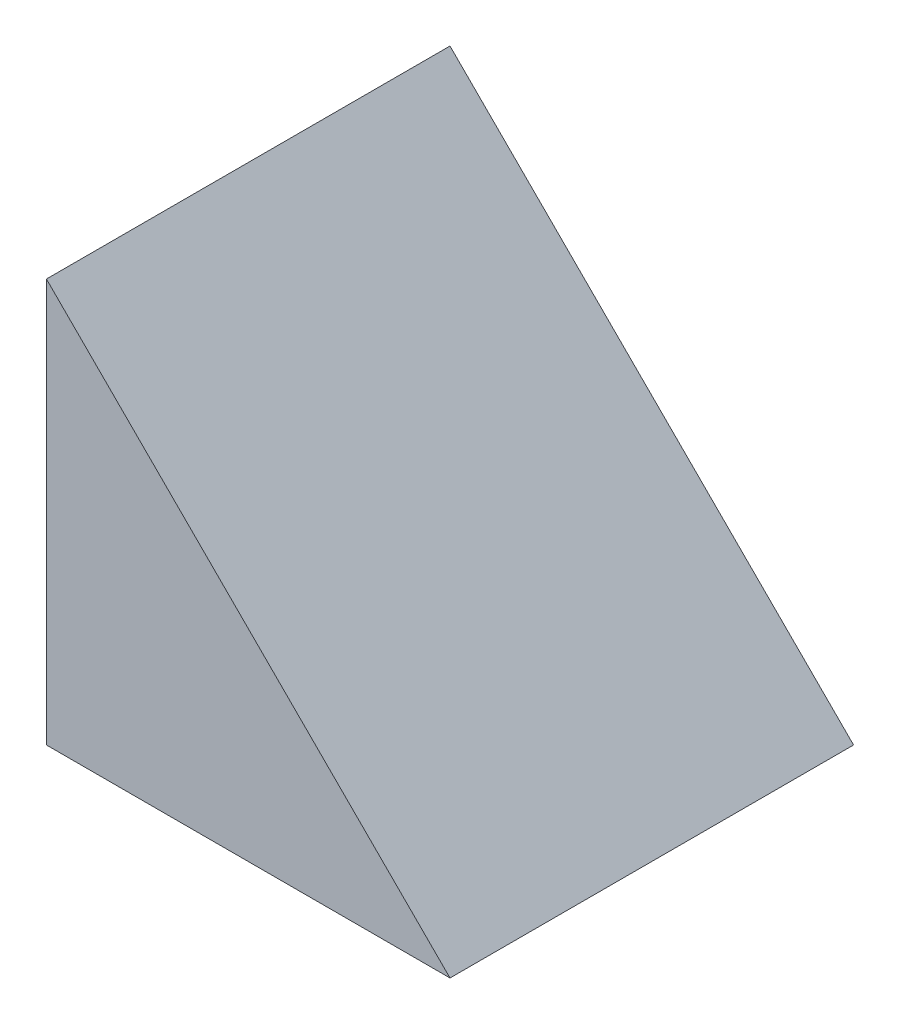
ISO-10303-21;
HEADER;
FILE_DESCRIPTION(('STEP AP214'),'2;1');
FILE_NAME('part.step','',(''),(''),'','','');
FILE_SCHEMA(('AUTOMOTIVE_DESIGN { 1 0 10303 214 1 1 1 1 }'));
ENDSEC;
DATA;
#1=APPLICATION_CONTEXT('core data for automotive mechanical design processes');
#2=APPLICATION_PROTOCOL_DEFINITION('international standard','automotive_design',2000,#1);
#3=PRODUCT_CONTEXT('',#1,'mechanical');
#4=PRODUCT('Part','Part','',(#3));
#5=PRODUCT_RELATED_PRODUCT_CATEGORY('part','',(#4));
#6=PRODUCT_DEFINITION_FORMATION('','',#4);
#7=PRODUCT_DEFINITION_CONTEXT('part definition',#1,'design');
#8=PRODUCT_DEFINITION('design','',#6,#7);
#9=PRODUCT_DEFINITION_SHAPE('','',#8);
#10=(LENGTH_UNIT() NAMED_UNIT(*) SI_UNIT(.MILLI.,.METRE.));
#11=(NAMED_UNIT(*) PLANE_ANGLE_UNIT() SI_UNIT($,.RADIAN.));
#12=(NAMED_UNIT(*) SI_UNIT($,.STERADIAN.) SOLID_ANGLE_UNIT());
#13=UNCERTAINTY_MEASURE_WITH_UNIT(LENGTH_MEASURE(1.E-05),#10,'distance_accuracy_value','');
#14=(GEOMETRIC_REPRESENTATION_CONTEXT(3) GLOBAL_UNCERTAINTY_ASSIGNED_CONTEXT((#13)) GLOBAL_UNIT_ASSIGNED_CONTEXT((#10,
#11,#12)) REPRESENTATION_CONTEXT('',''));
#15=CARTESIAN_POINT('',(0.,0.,0.));
#16=DIRECTION('',(0.,0.,1.));
#17=DIRECTION('',(1.,0.,0.));
#18=AXIS2_PLACEMENT_3D('',#15,#16,#17);
#19=CARTESIAN_POINT('',(0.,0.,114.3));
#20=DIRECTION('',(1.,0.,0.));
#21=DIRECTION('',(0.,0.,-1.));
#22=AXIS2_PLACEMENT_3D('',#19,#20,#21);
#23=PLANE('',#22);
#24=DIRECTION('',(0.,-1.,0.));
#25=VECTOR('',#24,1.);
#26=CARTESIAN_POINT('',(0.,0.,0.));
#27=LINE('',#26,#25);
#28=CARTESIAN_POINT('',(0.,114.3,0.));
#29=VERTEX_POINT('',#28);
#30=CARTESIAN_POINT('',(0.,0.,0.));
#31=VERTEX_POINT('',#30);
#32=EDGE_CURVE('E80',#29,#31,#27,.T.);
#33=ORIENTED_EDGE('',*,*,#32,.T.);
#34=DIRECTION('',(0.,0.,-1.));
#35=VECTOR('',#34,1.);
#36=CARTESIAN_POINT('',(0.,0.,114.3));
#37=LINE('',#36,#35);
#38=CARTESIAN_POINT('',(0.,0.,114.3));
#39=VERTEX_POINT('',#38);
#40=EDGE_CURVE('E11',#39,#31,#37,.T.);
#41=ORIENTED_EDGE('',*,*,#40,.F.);
#42=DIRECTION('',(0.,-1.,0.));
#43=VECTOR('',#42,1.);
#44=CARTESIAN_POINT('',(0.,0.,114.3));
#45=LINE('',#44,#43);
#46=CARTESIAN_POINT('',(0.,114.3,114.3));
#47=VERTEX_POINT('',#46);
#48=EDGE_CURVE('E73',#47,#39,#45,.T.);
#49=ORIENTED_EDGE('',*,*,#48,.F.);
#50=DIRECTION('',(0.,0.,-1.));
#51=VECTOR('',#50,1.);
#52=CARTESIAN_POINT('',(0.,114.3,114.3));
#53=LINE('',#52,#51);
#54=EDGE_CURVE('E81',#47,#29,#53,.T.);
#55=ORIENTED_EDGE('',*,*,#54,.T.);
#56=EDGE_LOOP('',(#33,#41,#49,#55));
#57=FACE_BOUND('',#56,.T.);
#58=ADVANCED_FACE('F33',(#57),#23,.F.);
#59=CARTESIAN_POINT('',(0.,0.,114.3));
#60=DIRECTION('',(0.,1.,0.));
#61=DIRECTION('',(0.,0.,1.));
#62=AXIS2_PLACEMENT_3D('',#59,#60,#61);
#63=PLANE('',#62);
#64=DIRECTION('',(1.,0.,0.));
#65=VECTOR('',#64,1.);
#66=CARTESIAN_POINT('',(0.,0.,0.));
#67=LINE('',#66,#65);
#68=CARTESIAN_POINT('',(114.3,0.,0.));
#69=VERTEX_POINT('',#68);
#70=EDGE_CURVE('E61',#31,#69,#67,.T.);
#71=ORIENTED_EDGE('',*,*,#70,.T.);
#72=DIRECTION('',(0.,0.,-1.));
#73=VECTOR('',#72,1.);
#74=CARTESIAN_POINT('',(114.3,0.,114.3));
#75=LINE('',#74,#73);
#76=CARTESIAN_POINT('',(114.3,0.,114.3));
#77=VERTEX_POINT('',#76);
#78=EDGE_CURVE('E41',#77,#69,#75,.T.);
#79=ORIENTED_EDGE('',*,*,#78,.F.);
#80=DIRECTION('',(1.,0.,0.));
#81=VECTOR('',#80,1.);
#82=CARTESIAN_POINT('',(0.,0.,114.3));
#83=LINE('',#82,#81);
#84=EDGE_CURVE('E69',#39,#77,#83,.T.);
#85=ORIENTED_EDGE('',*,*,#84,.F.);
#86=ORIENTED_EDGE('',*,*,#40,.T.);
#87=EDGE_LOOP('',(#71,#79,#85,#86));
#88=FACE_BOUND('',#87,.T.);
#89=ADVANCED_FACE('F70',(#88),#63,.F.);
#90=CARTESIAN_POINT('',(0.,114.3,114.3));
#91=DIRECTION('',(-0.707106781186547,-0.707106781186547,0.));
#92=DIRECTION('',(0.707106781186548,-0.707106781186548,0.));
#93=AXIS2_PLACEMENT_3D('',#90,#91,#92);
#94=PLANE('',#93);
#95=DIRECTION('',(-0.707106781186548,0.707106781186548,0.));
#96=VECTOR('',#95,1.);
#97=CARTESIAN_POINT('',(0.,114.3,0.));
#98=LINE('',#97,#96);
#99=EDGE_CURVE('E66',#69,#29,#98,.T.);
#100=ORIENTED_EDGE('',*,*,#99,.T.);
#101=ORIENTED_EDGE('',*,*,#54,.F.);
#102=DIRECTION('',(-0.707106781186548,0.707106781186548,0.));
#103=VECTOR('',#102,1.);
#104=CARTESIAN_POINT('',(0.,114.3,114.3));
#105=LINE('',#104,#103);
#106=EDGE_CURVE('E49',#77,#47,#105,.T.);
#107=ORIENTED_EDGE('',*,*,#106,.F.);
#108=ORIENTED_EDGE('',*,*,#78,.T.);
#109=EDGE_LOOP('',(#100,#101,#107,#108));
#110=FACE_BOUND('',#109,.T.);
#111=ADVANCED_FACE('F88',(#110),#94,.F.);
#112=CARTESIAN_POINT('',(0.,0.,114.3));
#113=DIRECTION('',(0.,0.,-1.));
#114=DIRECTION('',(-1.,0.,0.));
#115=AXIS2_PLACEMENT_3D('',#112,#113,#114);
#116=PLANE('',#115);
#117=ORIENTED_EDGE('',*,*,#48,.T.);
#118=ORIENTED_EDGE('',*,*,#84,.T.);
#119=ORIENTED_EDGE('',*,*,#106,.T.);
#120=EDGE_LOOP('',(#117,#118,#119));
#121=FACE_BOUND('',#120,.T.);
#122=ADVANCED_FACE('F76',(#121),#116,.F.);
#123=CARTESIAN_POINT('',(0.,0.,0.));
#124=DIRECTION('',(0.,0.,-1.));
#125=DIRECTION('',(-1.,0.,0.));
#126=AXIS2_PLACEMENT_3D('',#123,#124,#125);
#127=PLANE('',#126);
#128=ORIENTED_EDGE('',*,*,#32,.F.);
#129=ORIENTED_EDGE('',*,*,#99,.F.);
#130=ORIENTED_EDGE('',*,*,#70,.F.);
#131=EDGE_LOOP('',(#128,#129,#130));
#132=FACE_BOUND('',#131,.T.);
#133=ADVANCED_FACE('F89',(#132),#127,.T.);
#134=CLOSED_SHELL('',(#58,#89,#111,#122,#133));
#135=MANIFOLD_SOLID_BREP('B2',#134);
#136=ADVANCED_BREP_SHAPE_REPRESENTATION('',(#18,#135),#14);
#137=SHAPE_DEFINITION_REPRESENTATION(#9,#136);
ENDSEC;
END-ISO-10303-21;
